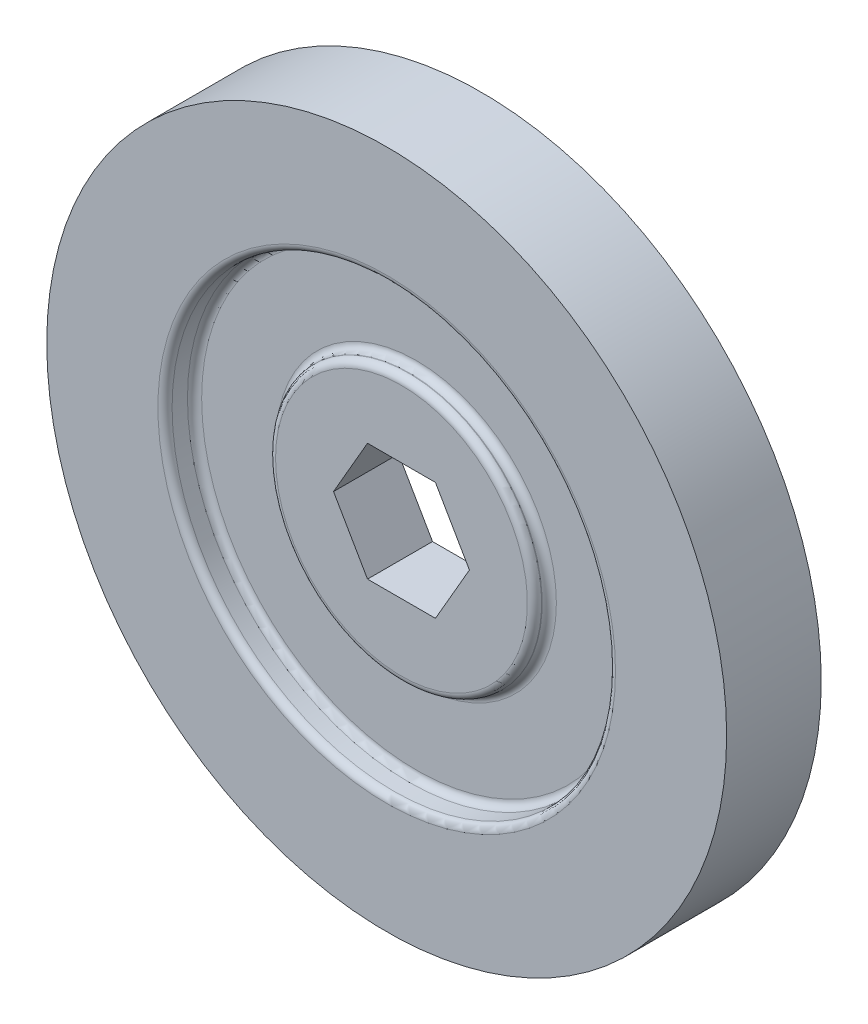
ISO-10303-21;
HEADER;
FILE_DESCRIPTION(('STEP AP214'),'2;1');
FILE_NAME('part.step','',(''),(''),'','','');
FILE_SCHEMA(('AUTOMOTIVE_DESIGN { 1 0 10303 214 1 1 1 1 }'));
ENDSEC;
DATA;
#1=APPLICATION_CONTEXT('core data for automotive mechanical design processes');
#2=APPLICATION_PROTOCOL_DEFINITION('international standard','automotive_design',2000,#1);
#3=PRODUCT_CONTEXT('',#1,'mechanical');
#4=PRODUCT('Part','Part','',(#3));
#5=PRODUCT_RELATED_PRODUCT_CATEGORY('part','',(#4));
#6=PRODUCT_DEFINITION_FORMATION('','',#4);
#7=PRODUCT_DEFINITION_CONTEXT('part definition',#1,'design');
#8=PRODUCT_DEFINITION('design','',#6,#7);
#9=PRODUCT_DEFINITION_SHAPE('','',#8);
#10=(LENGTH_UNIT() NAMED_UNIT(*) SI_UNIT(.MILLI.,.METRE.));
#11=(NAMED_UNIT(*) PLANE_ANGLE_UNIT() SI_UNIT($,.RADIAN.));
#12=(NAMED_UNIT(*) SI_UNIT($,.STERADIAN.) SOLID_ANGLE_UNIT());
#13=UNCERTAINTY_MEASURE_WITH_UNIT(LENGTH_MEASURE(1.E-05),#10,'distance_accuracy_value','');
#14=(GEOMETRIC_REPRESENTATION_CONTEXT(3) GLOBAL_UNCERTAINTY_ASSIGNED_CONTEXT((#13)) GLOBAL_UNIT_ASSIGNED_CONTEXT((#10,
#11,#12)) REPRESENTATION_CONTEXT('',''));
#15=CARTESIAN_POINT('',(0.,0.,0.));
#16=DIRECTION('',(0.,0.,1.));
#17=DIRECTION('',(1.,0.,0.));
#18=AXIS2_PLACEMENT_3D('',#15,#16,#17);
#19=CARTESIAN_POINT('',(0.,0.,-5.08));
#20=DIRECTION('',(0.,0.,1.));
#21=DIRECTION('',(1.,0.,0.));
#22=AXIS2_PLACEMENT_3D('',#19,#20,#21);
#23=CYLINDRICAL_SURFACE('',#22,36.5125);
#24=CARTESIAN_POINT('',(0.,0.,-5.08));
#25=DIRECTION('',(0.,0.,1.));
#26=DIRECTION('',(1.,0.,0.));
#27=AXIS2_PLACEMENT_3D('',#24,#25,#26);
#28=CIRCLE('',#27,36.5125);
#29=CARTESIAN_POINT('',(36.5125,0.,-5.08));
#30=VERTEX_POINT('',#29);
#31=EDGE_CURVE('E119',#30,#30,#28,.T.);
#32=ORIENTED_EDGE('',*,*,#31,.T.);
#33=EDGE_LOOP('',(#32));
#34=FACE_BOUND('',#33,.T.);
#35=CARTESIAN_POINT('',(0.,0.,5.08));
#36=DIRECTION('',(0.,0.,1.));
#37=DIRECTION('',(1.,0.,0.));
#38=AXIS2_PLACEMENT_3D('',#35,#36,#37);
#39=CIRCLE('',#38,36.5125);
#40=CARTESIAN_POINT('',(36.5125,0.,5.08));
#41=VERTEX_POINT('',#40);
#42=EDGE_CURVE('E116',#41,#41,#39,.T.);
#43=ORIENTED_EDGE('',*,*,#42,.F.);
#44=EDGE_LOOP('',(#43));
#45=FACE_BOUND('',#44,.T.);
#46=ADVANCED_FACE('F34',(#34,#45),#23,.T.);
#47=CARTESIAN_POINT('',(0.,0.,-5.08));
#48=DIRECTION('',(0.,0.,1.));
#49=DIRECTION('',(1.,0.,0.));
#50=AXIS2_PLACEMENT_3D('',#47,#48,#49);
#51=PLANE('',#50);
#52=CARTESIAN_POINT('',(0.,0.,-5.08));
#53=DIRECTION('',(0.,0.,1.));
#54=DIRECTION('',(1.,0.,0.));
#55=AXIS2_PLACEMENT_3D('',#52,#53,#54);
#56=CIRCLE('',#55,24.5745);
#57=CARTESIAN_POINT('',(24.5745,0.,-5.08));
#58=VERTEX_POINT('',#57);
#59=EDGE_CURVE('E135',#58,#58,#56,.T.);
#60=ORIENTED_EDGE('',*,*,#59,.T.);
#61=EDGE_LOOP('',(#60));
#62=FACE_BOUND('',#61,.T.);
#63=ORIENTED_EDGE('',*,*,#31,.F.);
#64=EDGE_LOOP('',(#63));
#65=FACE_BOUND('',#64,.T.);
#66=ADVANCED_FACE('F184',(#62,#65),#51,.F.);
#67=CARTESIAN_POINT('',(0.,0.,5.08));
#68=DIRECTION('',(0.,0.,1.));
#69=DIRECTION('',(1.,0.,0.));
#70=AXIS2_PLACEMENT_3D('',#67,#68,#69);
#71=PLANE('',#70);
#72=CARTESIAN_POINT('',(0.,0.,5.08));
#73=DIRECTION('',(0.,0.,1.));
#74=DIRECTION('',(1.,0.,0.));
#75=AXIS2_PLACEMENT_3D('',#72,#73,#74);
#76=CIRCLE('',#75,24.5745);
#77=CARTESIAN_POINT('',(24.5745,0.,5.08));
#78=VERTEX_POINT('',#77);
#79=EDGE_CURVE('E93',#78,#78,#76,.F.);
#80=ORIENTED_EDGE('',*,*,#79,.T.);
#81=EDGE_LOOP('',(#80));
#82=FACE_BOUND('',#81,.T.);
#83=ORIENTED_EDGE('',*,*,#42,.T.);
#84=EDGE_LOOP('',(#83));
#85=FACE_BOUND('',#84,.T.);
#86=ADVANCED_FACE('F190',(#82,#85),#71,.T.);
#87=CARTESIAN_POINT('',(7.29770740255687,0.,-5.08));
#88=DIRECTION('',(0.866025403784438,0.5,0.));
#89=DIRECTION('',(-0.5,0.866025403784438,0.));
#90=AXIS2_PLACEMENT_3D('',#87,#88,#89);
#91=PLANE('',#90);
#92=DIRECTION('',(0.,0.,1.));
#93=VECTOR('',#92,1.);
#94=CARTESIAN_POINT('',(7.29770740255687,0.,-5.08));
#95=LINE('',#94,#93);
#96=CARTESIAN_POINT('',(7.29770740255687,0.,-3.4925));
#97=VERTEX_POINT('',#96);
#98=CARTESIAN_POINT('',(7.29770740255687,0.,3.4925));
#99=VERTEX_POINT('',#98);
#100=EDGE_CURVE('E102',#97,#99,#95,.T.);
#101=ORIENTED_EDGE('',*,*,#100,.T.);
#102=DIRECTION('',(-0.5,0.866025403784438,0.));
#103=VECTOR('',#102,1.);
#104=CARTESIAN_POINT('',(7.29770740255687,0.,3.4925));
#105=LINE('',#104,#103);
#106=CARTESIAN_POINT('',(3.64885370127844,6.32,3.4925));
#107=VERTEX_POINT('',#106);
#108=EDGE_CURVE('E87',#99,#107,#105,.T.);
#109=ORIENTED_EDGE('',*,*,#108,.T.);
#110=DIRECTION('',(0.,0.,1.));
#111=VECTOR('',#110,1.);
#112=CARTESIAN_POINT('',(3.64885370127844,6.32,-5.08));
#113=LINE('',#112,#111);
#114=CARTESIAN_POINT('',(3.64885370127844,6.32,-3.4925));
#115=VERTEX_POINT('',#114);
#116=EDGE_CURVE('E100',#115,#107,#113,.T.);
#117=ORIENTED_EDGE('',*,*,#116,.F.);
#118=DIRECTION('',(0.5,-0.866025403784438,0.));
#119=VECTOR('',#118,1.);
#120=CARTESIAN_POINT('',(7.29770740255687,0.,-3.4925));
#121=LINE('',#120,#119);
#122=EDGE_CURVE('E57',#115,#97,#121,.T.);
#123=ORIENTED_EDGE('',*,*,#122,.T.);
#124=EDGE_LOOP('',(#101,#109,#117,#123));
#125=FACE_BOUND('',#124,.T.);
#126=ADVANCED_FACE('F99',(#125),#91,.F.);
#127=CARTESIAN_POINT('',(3.64885370127844,-6.32,-5.08));
#128=DIRECTION('',(0.866025403784439,-0.5,0.));
#129=DIRECTION('',(0.5,0.866025403784439,0.));
#130=AXIS2_PLACEMENT_3D('',#127,#128,#129);
#131=PLANE('',#130);
#132=DIRECTION('',(0.,0.,1.));
#133=VECTOR('',#132,1.);
#134=CARTESIAN_POINT('',(3.64885370127844,-6.32,-5.08));
#135=LINE('',#134,#133);
#136=CARTESIAN_POINT('',(3.64885370127844,-6.32,-3.4925));
#137=VERTEX_POINT('',#136);
#138=CARTESIAN_POINT('',(3.64885370127844,-6.32,3.4925));
#139=VERTEX_POINT('',#138);
#140=EDGE_CURVE('E409',#137,#139,#135,.T.);
#141=ORIENTED_EDGE('',*,*,#140,.T.);
#142=DIRECTION('',(0.5,0.866025403784439,0.));
#143=VECTOR('',#142,1.);
#144=CARTESIAN_POINT('',(3.64885370127844,-6.32,3.4925));
#145=LINE('',#144,#143);
#146=EDGE_CURVE('E104',#139,#99,#145,.T.);
#147=ORIENTED_EDGE('',*,*,#146,.T.);
#148=ORIENTED_EDGE('',*,*,#100,.F.);
#149=DIRECTION('',(-0.5,-0.866025403784439,0.));
#150=VECTOR('',#149,1.);
#151=CARTESIAN_POINT('',(3.64885370127844,-6.32,-3.4925));
#152=LINE('',#151,#150);
#153=EDGE_CURVE('E112',#97,#137,#152,.T.);
#154=ORIENTED_EDGE('',*,*,#153,.T.);
#155=EDGE_LOOP('',(#141,#147,#148,#154));
#156=FACE_BOUND('',#155,.T.);
#157=ADVANCED_FACE('F349',(#156),#131,.F.);
#158=CARTESIAN_POINT('',(-3.64885370127843,-6.32,-5.08));
#159=DIRECTION('',(0.,-1.,0.));
#160=DIRECTION('',(1.,0.,0.));
#161=AXIS2_PLACEMENT_3D('',#158,#159,#160);
#162=PLANE('',#161);
#163=DIRECTION('',(0.,0.,1.));
#164=VECTOR('',#163,1.);
#165=CARTESIAN_POINT('',(-3.64885370127843,-6.32,-5.08));
#166=LINE('',#165,#164);
#167=CARTESIAN_POINT('',(-3.64885370127843,-6.32,-3.4925));
#168=VERTEX_POINT('',#167);
#169=CARTESIAN_POINT('',(-3.64885370127843,-6.32,3.4925));
#170=VERTEX_POINT('',#169);
#171=EDGE_CURVE('E412',#168,#170,#166,.T.);
#172=ORIENTED_EDGE('',*,*,#171,.T.);
#173=DIRECTION('',(1.,0.,0.));
#174=VECTOR('',#173,1.);
#175=CARTESIAN_POINT('',(-3.64885370127843,-6.32,3.4925));
#176=LINE('',#175,#174);
#177=EDGE_CURVE('E427',#170,#139,#176,.T.);
#178=ORIENTED_EDGE('',*,*,#177,.T.);
#179=ORIENTED_EDGE('',*,*,#140,.F.);
#180=DIRECTION('',(-1.,0.,0.));
#181=VECTOR('',#180,1.);
#182=CARTESIAN_POINT('',(-3.64885370127843,-6.32,-3.4925));
#183=LINE('',#182,#181);
#184=EDGE_CURVE('E436',#137,#168,#183,.T.);
#185=ORIENTED_EDGE('',*,*,#184,.T.);
#186=EDGE_LOOP('',(#172,#178,#179,#185));
#187=FACE_BOUND('',#186,.T.);
#188=ADVANCED_FACE('F340',(#187),#162,.F.);
#189=CARTESIAN_POINT('',(-7.29770740255687,0.,-5.08));
#190=DIRECTION('',(-0.866025403784439,-0.5,0.));
#191=DIRECTION('',(0.5,-0.866025403784439,0.));
#192=AXIS2_PLACEMENT_3D('',#189,#190,#191);
#193=PLANE('',#192);
#194=DIRECTION('',(0.,0.,1.));
#195=VECTOR('',#194,1.);
#196=CARTESIAN_POINT('',(-7.29770740255687,0.,-5.08));
#197=LINE('',#196,#195);
#198=CARTESIAN_POINT('',(-7.29770740255687,0.,-3.4925));
#199=VERTEX_POINT('',#198);
#200=CARTESIAN_POINT('',(-7.29770740255687,0.,3.4925));
#201=VERTEX_POINT('',#200);
#202=EDGE_CURVE('E110',#199,#201,#197,.T.);
#203=ORIENTED_EDGE('',*,*,#202,.T.);
#204=DIRECTION('',(0.5,-0.866025403784439,0.));
#205=VECTOR('',#204,1.);
#206=CARTESIAN_POINT('',(-7.29770740255687,0.,3.4925));
#207=LINE('',#206,#205);
#208=EDGE_CURVE('E422',#201,#170,#207,.T.);
#209=ORIENTED_EDGE('',*,*,#208,.T.);
#210=ORIENTED_EDGE('',*,*,#171,.F.);
#211=DIRECTION('',(-0.5,0.866025403784439,0.));
#212=VECTOR('',#211,1.);
#213=CARTESIAN_POINT('',(-7.29770740255687,0.,-3.4925));
#214=LINE('',#213,#212);
#215=EDGE_CURVE('E423',#168,#199,#214,.T.);
#216=ORIENTED_EDGE('',*,*,#215,.T.);
#217=EDGE_LOOP('',(#203,#209,#210,#216));
#218=FACE_BOUND('',#217,.T.);
#219=ADVANCED_FACE('F331',(#218),#193,.F.);
#220=CARTESIAN_POINT('',(-3.64885370127843,6.32,-5.08));
#221=DIRECTION('',(-0.866025403784439,0.5,0.));
#222=DIRECTION('',(-0.5,-0.866025403784439,0.));
#223=AXIS2_PLACEMENT_3D('',#220,#221,#222);
#224=PLANE('',#223);
#225=DIRECTION('',(0.,0.,1.));
#226=VECTOR('',#225,1.);
#227=CARTESIAN_POINT('',(-3.64885370127843,6.32,-5.08));
#228=LINE('',#227,#226);
#229=CARTESIAN_POINT('',(-3.64885370127844,6.32,-3.4925));
#230=VERTEX_POINT('',#229);
#231=CARTESIAN_POINT('',(-3.64885370127843,6.32,3.4925));
#232=VERTEX_POINT('',#231);
#233=EDGE_CURVE('E108',#230,#232,#228,.T.);
#234=ORIENTED_EDGE('',*,*,#233,.T.);
#235=DIRECTION('',(-0.5,-0.866025403784439,0.));
#236=VECTOR('',#235,1.);
#237=CARTESIAN_POINT('',(-3.64885370127843,6.32,3.4925));
#238=LINE('',#237,#236);
#239=EDGE_CURVE('E49',#232,#201,#238,.T.);
#240=ORIENTED_EDGE('',*,*,#239,.T.);
#241=ORIENTED_EDGE('',*,*,#202,.F.);
#242=DIRECTION('',(0.5,0.866025403784439,0.));
#243=VECTOR('',#242,1.);
#244=CARTESIAN_POINT('',(-3.64885370127843,6.32,-3.4925));
#245=LINE('',#244,#243);
#246=EDGE_CURVE('E425',#199,#230,#245,.T.);
#247=ORIENTED_EDGE('',*,*,#246,.T.);
#248=EDGE_LOOP('',(#234,#240,#241,#247));
#249=FACE_BOUND('',#248,.T.);
#250=ADVANCED_FACE('F323',(#249),#224,.F.);
#251=CARTESIAN_POINT('',(3.64885370127844,6.32,-5.08));
#252=DIRECTION('',(0.,1.,0.));
#253=DIRECTION('',(-1.,0.,0.));
#254=AXIS2_PLACEMENT_3D('',#251,#252,#253);
#255=PLANE('',#254);
#256=ORIENTED_EDGE('',*,*,#116,.T.);
#257=DIRECTION('',(-1.,0.,0.));
#258=VECTOR('',#257,1.);
#259=CARTESIAN_POINT('',(3.64885370127844,6.32,3.4925));
#260=LINE('',#259,#258);
#261=EDGE_CURVE('E84',#107,#232,#260,.T.);
#262=ORIENTED_EDGE('',*,*,#261,.T.);
#263=ORIENTED_EDGE('',*,*,#233,.F.);
#264=DIRECTION('',(1.,0.,0.));
#265=VECTOR('',#264,1.);
#266=CARTESIAN_POINT('',(3.64885370127844,6.32,-3.4925));
#267=LINE('',#266,#265);
#268=EDGE_CURVE('E107',#230,#115,#267,.T.);
#269=ORIENTED_EDGE('',*,*,#268,.T.);
#270=EDGE_LOOP('',(#256,#262,#263,#269));
#271=FACE_BOUND('',#270,.T.);
#272=ADVANCED_FACE('F106',(#271),#255,.F.);
#273=CARTESIAN_POINT('',(0.,0.,-3.4925));
#274=DIRECTION('',(0.,0.,1.));
#275=DIRECTION('',(1.,0.,0.));
#276=AXIS2_PLACEMENT_3D('',#273,#274,#275);
#277=PLANE('',#276);
#278=CARTESIAN_POINT('',(0.,0.,-3.4925));
#279=DIRECTION('',(0.,0.,1.));
#280=DIRECTION('',(1.,0.,0.));
#281=AXIS2_PLACEMENT_3D('',#278,#279,#280);
#282=CIRCLE('',#281,13.5255);
#283=CARTESIAN_POINT('',(13.5255,0.,-3.4925));
#284=VERTEX_POINT('',#283);
#285=EDGE_CURVE('E94',#284,#284,#282,.F.);
#286=ORIENTED_EDGE('',*,*,#285,.T.);
#287=EDGE_LOOP('',(#286));
#288=FACE_BOUND('',#287,.T.);
#289=ORIENTED_EDGE('',*,*,#268,.F.);
#290=ORIENTED_EDGE('',*,*,#246,.F.);
#291=ORIENTED_EDGE('',*,*,#215,.F.);
#292=ORIENTED_EDGE('',*,*,#184,.F.);
#293=ORIENTED_EDGE('',*,*,#153,.F.);
#294=ORIENTED_EDGE('',*,*,#122,.F.);
#295=EDGE_LOOP('',(#289,#290,#291,#292,#293,#294));
#296=FACE_BOUND('',#295,.T.);
#297=ADVANCED_FACE('F305',(#288,#296),#277,.F.);
#298=CARTESIAN_POINT('',(0.,14.2875,-1.905));
#299=DIRECTION('',(0.,0.,1.));
#300=DIRECTION('',(1.,0.,0.));
#301=AXIS2_PLACEMENT_3D('',#298,#299,#300);
#302=PLANE('',#301);
#303=CARTESIAN_POINT('',(0.,0.,-1.905));
#304=DIRECTION('',(0.,0.,1.));
#305=DIRECTION('',(1.,0.,0.));
#306=AXIS2_PLACEMENT_3D('',#303,#304,#305);
#307=CIRCLE('',#306,15.0495);
#308=CARTESIAN_POINT('',(15.0495,0.,-1.905));
#309=VERTEX_POINT('',#308);
#310=EDGE_CURVE('E129',#309,#309,#307,.T.);
#311=ORIENTED_EDGE('',*,*,#310,.T.);
#312=EDGE_LOOP('',(#311));
#313=FACE_BOUND('',#312,.T.);
#314=CARTESIAN_POINT('',(0.,0.,-1.905));
#315=DIRECTION('',(0.,0.,-1.));
#316=DIRECTION('',(-1.,0.,0.));
#317=AXIS2_PLACEMENT_3D('',#314,#315,#316);
#318=CIRCLE('',#317,23.8125);
#319=CARTESIAN_POINT('',(-23.8125,0.,-1.905));
#320=VERTEX_POINT('',#319);
#321=EDGE_CURVE('E103',#320,#320,#318,.T.);
#322=ORIENTED_EDGE('',*,*,#321,.T.);
#323=EDGE_LOOP('',(#322));
#324=FACE_BOUND('',#323,.T.);
#325=ADVANCED_FACE('F296',(#313,#324),#302,.F.);
#326=CARTESIAN_POINT('',(0.,0.,-22.7530353955303));
#327=DIRECTION('',(0.,0.,-1.));
#328=DIRECTION('',(-1.,0.,0.));
#329=AXIS2_PLACEMENT_3D('',#326,#327,#328);
#330=CYLINDRICAL_SURFACE('',#329,23.8125);
#331=CARTESIAN_POINT('',(0.,0.,-4.318));
#332=DIRECTION('',(0.,0.,1.));
#333=DIRECTION('',(1.,0.,0.));
#334=AXIS2_PLACEMENT_3D('',#331,#332,#333);
#335=CIRCLE('',#334,23.8125);
#336=CARTESIAN_POINT('',(23.8125,0.,-4.318));
#337=VERTEX_POINT('',#336);
#338=EDGE_CURVE('E132',#337,#337,#335,.F.);
#339=ORIENTED_EDGE('',*,*,#338,.T.);
#340=EDGE_LOOP('',(#339));
#341=FACE_BOUND('',#340,.T.);
#342=ORIENTED_EDGE('',*,*,#321,.F.);
#343=EDGE_LOOP('',(#342));
#344=FACE_BOUND('',#343,.T.);
#345=ADVANCED_FACE('F288',(#341,#344),#330,.F.);
#346=CARTESIAN_POINT('',(0.,0.,-22.7530353955303));
#347=DIRECTION('',(0.,0.,-1.));
#348=DIRECTION('',(-1.,0.,0.));
#349=AXIS2_PLACEMENT_3D('',#346,#347,#348);
#350=CYLINDRICAL_SURFACE('',#349,14.2875);
#351=CARTESIAN_POINT('',(0.,0.,-2.667));
#352=DIRECTION('',(0.,0.,1.));
#353=DIRECTION('',(1.,0.,0.));
#354=AXIS2_PLACEMENT_3D('',#351,#352,#353);
#355=CIRCLE('',#354,14.2875);
#356=CARTESIAN_POINT('',(14.2875,0.,-2.667));
#357=VERTEX_POINT('',#356);
#358=EDGE_CURVE('E126',#357,#357,#355,.F.);
#359=ORIENTED_EDGE('',*,*,#358,.T.);
#360=EDGE_LOOP('',(#359));
#361=FACE_BOUND('',#360,.T.);
#362=CARTESIAN_POINT('',(0.,0.,-2.7305));
#363=DIRECTION('',(0.,0.,1.));
#364=DIRECTION('',(1.,0.,0.));
#365=AXIS2_PLACEMENT_3D('',#362,#363,#364);
#366=CIRCLE('',#365,14.2875);
#367=CARTESIAN_POINT('',(14.2875,0.,-2.7305));
#368=VERTEX_POINT('',#367);
#369=EDGE_CURVE('E123',#368,#368,#366,.T.);
#370=ORIENTED_EDGE('',*,*,#369,.T.);
#371=EDGE_LOOP('',(#370));
#372=FACE_BOUND('',#371,.T.);
#373=ADVANCED_FACE('F200',(#361,#372),#350,.T.);
#374=CARTESIAN_POINT('',(0.,0.,-2.667));
#375=DIRECTION('',(0.,0.,1.));
#376=DIRECTION('',(1.,0.,0.));
#377=AXIS2_PLACEMENT_3D('',#374,#375,#376);
#378=TOROIDAL_SURFACE('',#377,15.0495,0.762);
#379=ORIENTED_EDGE('',*,*,#310,.F.);
#380=EDGE_LOOP('',(#379));
#381=FACE_BOUND('',#380,.T.);
#382=ORIENTED_EDGE('',*,*,#358,.F.);
#383=EDGE_LOOP('',(#382));
#384=FACE_BOUND('',#383,.T.);
#385=ADVANCED_FACE('F196',(#381,#384),#378,.F.);
#386=CARTESIAN_POINT('',(0.,0.,-4.318));
#387=DIRECTION('',(0.,0.,1.));
#388=DIRECTION('',(1.,0.,0.));
#389=AXIS2_PLACEMENT_3D('',#386,#387,#388);
#390=TOROIDAL_SURFACE('',#389,24.5745,0.762);
#391=ORIENTED_EDGE('',*,*,#59,.F.);
#392=EDGE_LOOP('',(#391));
#393=FACE_BOUND('',#392,.T.);
#394=ORIENTED_EDGE('',*,*,#338,.F.);
#395=EDGE_LOOP('',(#394));
#396=FACE_BOUND('',#395,.T.);
#397=ADVANCED_FACE('F199',(#393,#396),#390,.T.);
#398=CARTESIAN_POINT('',(0.,0.,-2.7305));
#399=DIRECTION('',(0.,0.,1.));
#400=DIRECTION('',(1.,0.,0.));
#401=AXIS2_PLACEMENT_3D('',#398,#399,#400);
#402=TOROIDAL_SURFACE('',#401,13.5255,0.762);
#403=ORIENTED_EDGE('',*,*,#369,.F.);
#404=EDGE_LOOP('',(#403));
#405=FACE_BOUND('',#404,.T.);
#406=ORIENTED_EDGE('',*,*,#285,.F.);
#407=EDGE_LOOP('',(#406));
#408=FACE_BOUND('',#407,.T.);
#409=ADVANCED_FACE('F179',(#405,#408),#402,.T.);
#410=CARTESIAN_POINT('',(0.,0.,3.4925));
#411=DIRECTION('',(0.,0.,-1.));
#412=DIRECTION('',(1.,0.,0.));
#413=AXIS2_PLACEMENT_3D('',#410,#411,#412);
#414=PLANE('',#413);
#415=CARTESIAN_POINT('',(0.,0.,3.4925));
#416=DIRECTION('',(0.,0.,-1.));
#417=DIRECTION('',(-1.,0.,0.));
#418=AXIS2_PLACEMENT_3D('',#415,#416,#417);
#419=CIRCLE('',#418,13.5255);
#420=CARTESIAN_POINT('',(-13.5255,0.,3.4925));
#421=VERTEX_POINT('',#420);
#422=EDGE_CURVE('E11',#421,#421,#419,.F.);
#423=ORIENTED_EDGE('',*,*,#422,.T.);
#424=EDGE_LOOP('',(#423));
#425=FACE_BOUND('',#424,.T.);
#426=ORIENTED_EDGE('',*,*,#146,.F.);
#427=ORIENTED_EDGE('',*,*,#177,.F.);
#428=ORIENTED_EDGE('',*,*,#208,.F.);
#429=ORIENTED_EDGE('',*,*,#239,.F.);
#430=ORIENTED_EDGE('',*,*,#261,.F.);
#431=ORIENTED_EDGE('',*,*,#108,.F.);
#432=EDGE_LOOP('',(#426,#427,#428,#429,#430,#431));
#433=FACE_BOUND('',#432,.T.);
#434=ADVANCED_FACE('F86',(#425,#433),#414,.F.);
#435=CARTESIAN_POINT('',(0.,14.2875,1.905));
#436=DIRECTION('',(0.,0.,-1.));
#437=DIRECTION('',(1.,0.,0.));
#438=AXIS2_PLACEMENT_3D('',#435,#436,#437);
#439=PLANE('',#438);
#440=CARTESIAN_POINT('',(0.,0.,1.905));
#441=DIRECTION('',(0.,0.,-1.));
#442=DIRECTION('',(-1.,0.,0.));
#443=AXIS2_PLACEMENT_3D('',#440,#441,#442);
#444=CIRCLE('',#443,23.0505);
#445=CARTESIAN_POINT('',(-23.0505,0.,1.905));
#446=VERTEX_POINT('',#445);
#447=EDGE_CURVE('E151',#446,#446,#444,.F.);
#448=ORIENTED_EDGE('',*,*,#447,.T.);
#449=EDGE_LOOP('',(#448));
#450=FACE_BOUND('',#449,.T.);
#451=CARTESIAN_POINT('',(0.,0.,1.905));
#452=DIRECTION('',(0.,0.,-1.));
#453=DIRECTION('',(-1.,0.,0.));
#454=AXIS2_PLACEMENT_3D('',#451,#452,#453);
#455=CIRCLE('',#454,15.0495);
#456=CARTESIAN_POINT('',(-15.0495,0.,1.905));
#457=VERTEX_POINT('',#456);
#458=EDGE_CURVE('E148',#457,#457,#455,.T.);
#459=ORIENTED_EDGE('',*,*,#458,.T.);
#460=EDGE_LOOP('',(#459));
#461=FACE_BOUND('',#460,.T.);
#462=ADVANCED_FACE('F168',(#450,#461),#439,.F.);
#463=CARTESIAN_POINT('',(0.,0.,22.7530353955303));
#464=DIRECTION('',(0.,0.,1.));
#465=DIRECTION('',(-1.,0.,0.));
#466=AXIS2_PLACEMENT_3D('',#463,#464,#465);
#467=CYLINDRICAL_SURFACE('',#466,23.8125);
#468=CARTESIAN_POINT('',(0.,0.,4.318));
#469=DIRECTION('',(0.,0.,1.));
#470=DIRECTION('',(1.,0.,0.));
#471=AXIS2_PLACEMENT_3D('',#468,#469,#470);
#472=CIRCLE('',#471,23.8125);
#473=CARTESIAN_POINT('',(23.8125,0.,4.318));
#474=VERTEX_POINT('',#473);
#475=EDGE_CURVE('E145',#474,#474,#472,.T.);
#476=ORIENTED_EDGE('',*,*,#475,.T.);
#477=EDGE_LOOP('',(#476));
#478=FACE_BOUND('',#477,.T.);
#479=CARTESIAN_POINT('',(0.,0.,2.667));
#480=DIRECTION('',(0.,0.,-1.));
#481=DIRECTION('',(-1.,0.,0.));
#482=AXIS2_PLACEMENT_3D('',#479,#480,#481);
#483=CIRCLE('',#482,23.8125);
#484=CARTESIAN_POINT('',(-23.8125,0.,2.667));
#485=VERTEX_POINT('',#484);
#486=EDGE_CURVE('E142',#485,#485,#483,.T.);
#487=ORIENTED_EDGE('',*,*,#486,.T.);
#488=EDGE_LOOP('',(#487));
#489=FACE_BOUND('',#488,.T.);
#490=ADVANCED_FACE('F170',(#478,#489),#467,.F.);
#491=CARTESIAN_POINT('',(0.,0.,22.7530353955303));
#492=DIRECTION('',(0.,0.,1.));
#493=DIRECTION('',(-1.,0.,0.));
#494=AXIS2_PLACEMENT_3D('',#491,#492,#493);
#495=CYLINDRICAL_SURFACE('',#494,14.2875);
#496=CARTESIAN_POINT('',(0.,0.,2.667));
#497=DIRECTION('',(0.,0.,-1.));
#498=DIRECTION('',(-1.,0.,0.));
#499=AXIS2_PLACEMENT_3D('',#496,#497,#498);
#500=CIRCLE('',#499,14.2875);
#501=CARTESIAN_POINT('',(-14.2875,0.,2.667));
#502=VERTEX_POINT('',#501);
#503=EDGE_CURVE('E42',#502,#502,#500,.F.);
#504=ORIENTED_EDGE('',*,*,#503,.T.);
#505=EDGE_LOOP('',(#504));
#506=FACE_BOUND('',#505,.T.);
#507=CARTESIAN_POINT('',(0.,0.,2.7305));
#508=DIRECTION('',(0.,0.,-1.));
#509=DIRECTION('',(-1.,0.,0.));
#510=AXIS2_PLACEMENT_3D('',#507,#508,#509);
#511=CIRCLE('',#510,14.2875);
#512=CARTESIAN_POINT('',(-14.2875,0.,2.7305));
#513=VERTEX_POINT('',#512);
#514=EDGE_CURVE('E154',#513,#513,#511,.T.);
#515=ORIENTED_EDGE('',*,*,#514,.T.);
#516=EDGE_LOOP('',(#515));
#517=FACE_BOUND('',#516,.T.);
#518=ADVANCED_FACE('F159',(#506,#517),#495,.T.);
#519=CARTESIAN_POINT('',(0.,0.,4.318));
#520=DIRECTION('',(0.,0.,1.));
#521=DIRECTION('',(1.,0.,0.));
#522=AXIS2_PLACEMENT_3D('',#519,#520,#521);
#523=TOROIDAL_SURFACE('',#522,24.5745,0.762);
#524=ORIENTED_EDGE('',*,*,#475,.F.);
#525=EDGE_LOOP('',(#524));
#526=FACE_BOUND('',#525,.T.);
#527=ORIENTED_EDGE('',*,*,#79,.F.);
#528=EDGE_LOOP('',(#527));
#529=FACE_BOUND('',#528,.T.);
#530=ADVANCED_FACE('F208',(#526,#529),#523,.T.);
#531=CARTESIAN_POINT('',(0.,0.,2.667));
#532=DIRECTION('',(0.,0.,-1.));
#533=DIRECTION('',(-1.,0.,0.));
#534=AXIS2_PLACEMENT_3D('',#531,#532,#533);
#535=TOROIDAL_SURFACE('',#534,23.0505,0.762);
#536=ORIENTED_EDGE('',*,*,#447,.F.);
#537=EDGE_LOOP('',(#536));
#538=FACE_BOUND('',#537,.T.);
#539=ORIENTED_EDGE('',*,*,#486,.F.);
#540=EDGE_LOOP('',(#539));
#541=FACE_BOUND('',#540,.T.);
#542=ADVANCED_FACE('F165',(#538,#541),#535,.F.);
#543=CARTESIAN_POINT('',(0.,0.,2.667));
#544=DIRECTION('',(0.,0.,-1.));
#545=DIRECTION('',(-1.,0.,0.));
#546=AXIS2_PLACEMENT_3D('',#543,#544,#545);
#547=TOROIDAL_SURFACE('',#546,15.0495,0.762);
#548=ORIENTED_EDGE('',*,*,#503,.F.);
#549=EDGE_LOOP('',(#548));
#550=FACE_BOUND('',#549,.T.);
#551=ORIENTED_EDGE('',*,*,#458,.F.);
#552=EDGE_LOOP('',(#551));
#553=FACE_BOUND('',#552,.T.);
#554=ADVANCED_FACE('F162',(#550,#553),#547,.F.);
#555=CARTESIAN_POINT('',(0.,0.,2.7305));
#556=DIRECTION('',(0.,0.,-1.));
#557=DIRECTION('',(-1.,0.,0.));
#558=AXIS2_PLACEMENT_3D('',#555,#556,#557);
#559=TOROIDAL_SURFACE('',#558,13.5255,0.762);
#560=ORIENTED_EDGE('',*,*,#422,.F.);
#561=EDGE_LOOP('',(#560));
#562=FACE_BOUND('',#561,.T.);
#563=ORIENTED_EDGE('',*,*,#514,.F.);
#564=EDGE_LOOP('',(#563));
#565=FACE_BOUND('',#564,.T.);
#566=ADVANCED_FACE('F36',(#562,#565),#559,.T.);
#567=CLOSED_SHELL('',(#46,#66,#86,#126,#157,#188,#219,#250,#272,#297,#325,#345,#373,#385,#397,
#409,#434,#462,#490,#518,#530,#542,#554,#566));
#568=MANIFOLD_SOLID_BREP('B2',#567);
#569=ADVANCED_BREP_SHAPE_REPRESENTATION('',(#18,#568),#14);
#570=SHAPE_DEFINITION_REPRESENTATION(#9,#569);
ENDSEC;
END-ISO-10303-21;
